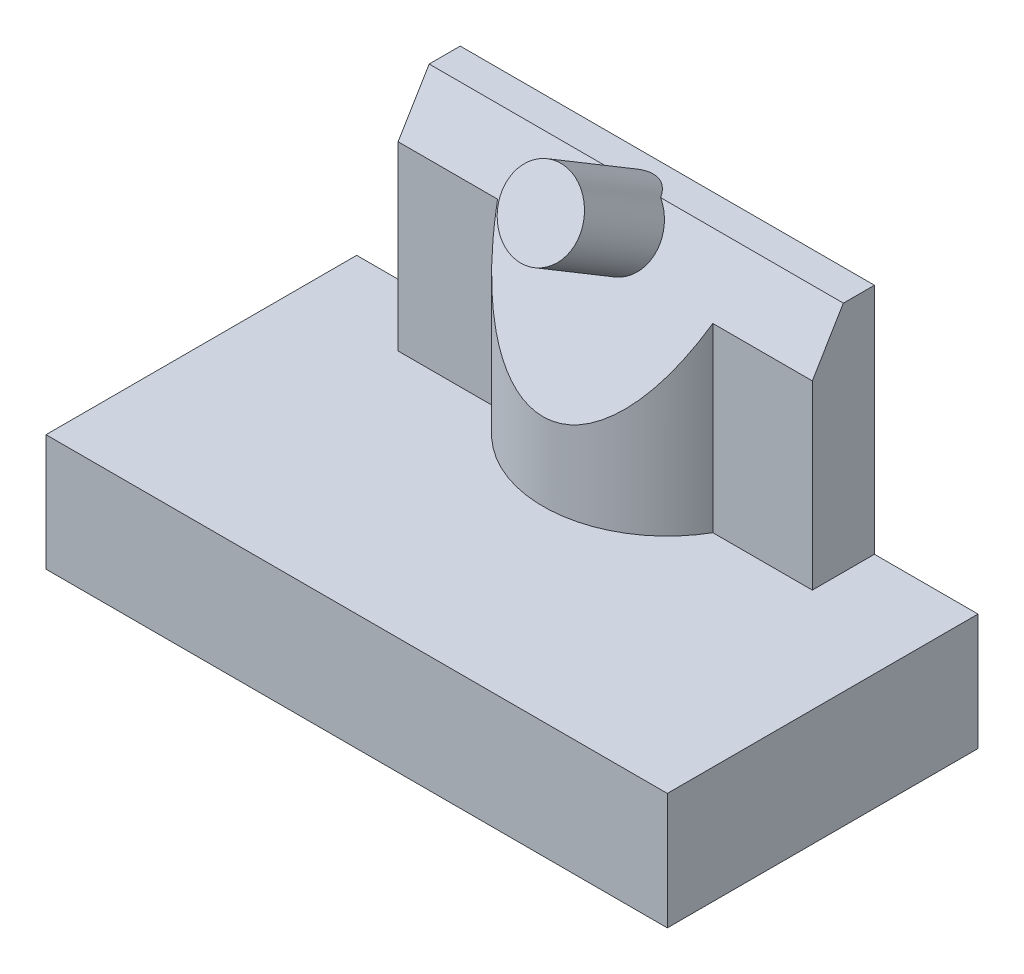
ISO-10303-21;
HEADER;
FILE_DESCRIPTION(('STEP AP214'),'2;1');
FILE_NAME('part.step','',(''),(''),'','','');
FILE_SCHEMA(('AUTOMOTIVE_DESIGN { 1 0 10303 214 1 1 1 1 }'));
ENDSEC;
DATA;
#1=APPLICATION_CONTEXT('core data for automotive mechanical design processes');
#2=APPLICATION_PROTOCOL_DEFINITION('international standard','automotive_design',2000,#1);
#3=PRODUCT_CONTEXT('',#1,'mechanical');
#4=PRODUCT('Part','Part','',(#3));
#5=PRODUCT_RELATED_PRODUCT_CATEGORY('part','',(#4));
#6=PRODUCT_DEFINITION_FORMATION('','',#4);
#7=PRODUCT_DEFINITION_CONTEXT('part definition',#1,'design');
#8=PRODUCT_DEFINITION('design','',#6,#7);
#9=PRODUCT_DEFINITION_SHAPE('','',#8);
#10=(LENGTH_UNIT() NAMED_UNIT(*) SI_UNIT(.MILLI.,.METRE.));
#11=(NAMED_UNIT(*) PLANE_ANGLE_UNIT() SI_UNIT($,.RADIAN.));
#12=(NAMED_UNIT(*) SI_UNIT($,.STERADIAN.) SOLID_ANGLE_UNIT());
#13=UNCERTAINTY_MEASURE_WITH_UNIT(LENGTH_MEASURE(1.E-05),#10,'distance_accuracy_value','');
#14=(GEOMETRIC_REPRESENTATION_CONTEXT(3) GLOBAL_UNCERTAINTY_ASSIGNED_CONTEXT((#13)) GLOBAL_UNIT_ASSIGNED_CONTEXT((#10,
#11,#12)) REPRESENTATION_CONTEXT('',''));
#15=CARTESIAN_POINT('',(0.,0.,0.));
#16=DIRECTION('',(0.,0.,1.));
#17=DIRECTION('',(1.,0.,0.));
#18=AXIS2_PLACEMENT_3D('',#15,#16,#17);
#19=CARTESIAN_POINT('',(-60.,37.5,-5.99750013866513));
#20=DIRECTION('',(0.,-0.51454829207469,-0.857461401535381));
#21=DIRECTION('',(0.,0.857461401535381,-0.51454829207469));
#22=AXIS2_PLACEMENT_3D('',#19,#20,#21);
#23=PLANE('',#22);
#24=CARTESIAN_POINT('',(0.,62.5006943094998,-21.0000000000001));
#25=DIRECTION('',(0.,0.514548292074691,0.85746140153538));
#26=DIRECTION('',(0.,-0.85746140153538,0.514548292074691));
#27=AXIS2_PLACEMENT_3D('',#24,#25,#26);
#28=CIRCLE('',#27,7.50000000000001);
#29=CARTESIAN_POINT('',(-4.71772642412974,67.5,-24.));
#30=VERTEX_POINT('',#29);
#31=CARTESIAN_POINT('',(4.71772642412976,67.5,-24.0000000000001));
#32=VERTEX_POINT('',#31);
#33=EDGE_CURVE('E47',#30,#32,#28,.T.);
#34=ORIENTED_EDGE('',*,*,#33,.F.);
#35=DIRECTION('',(-1.,0.,0.));
#36=VECTOR('',#35,1.);
#37=CARTESIAN_POINT('',(0.,67.5,-24.));
#38=LINE('',#37,#36);
#39=CARTESIAN_POINT('',(-40.,67.5,-24.));
#40=VERTEX_POINT('',#39);
#41=EDGE_CURVE('E41',#30,#40,#38,.T.);
#42=ORIENTED_EDGE('',*,*,#41,.T.);
#43=DIRECTION('',(0.,0.857461401535381,-0.51454829207469));
#44=VECTOR('',#43,1.);
#45=CARTESIAN_POINT('',(-40.,70.14723179808,-25.5885596692619));
#46=LINE('',#45,#44);
#47=CARTESIAN_POINT('',(-40.,57.5013886189996,-18.));
#48=VERTEX_POINT('',#47);
#49=EDGE_CURVE('E160',#48,#40,#46,.T.);
#50=ORIENTED_EDGE('',*,*,#49,.F.);
#51=DIRECTION('',(-1.,0.,0.));
#52=VECTOR('',#51,1.);
#53=CARTESIAN_POINT('',(-40.,57.5013886189996,-18.));
#54=LINE('',#53,#52);
#55=CARTESIAN_POINT('',(-20.7874962319511,57.5013886189997,-18.));
#56=VERTEX_POINT('',#55);
#57=EDGE_CURVE('E157',#56,#48,#54,.T.);
#58=ORIENTED_EDGE('',*,*,#57,.F.);
#59=CARTESIAN_POINT('',(0.,77.4986113810003,-30.));
#60=DIRECTION('',(0.,-0.51454829207469,-0.857461401535381));
#61=DIRECTION('',(0.,-0.857461401535381,0.51454829207469));
#62=AXIS2_PLACEMENT_3D('',#59,#60,#61);
#63=ELLIPSE('',#62,46.6477106833944,24.0024998613349);
#64=CARTESIAN_POINT('',(20.7874962319511,57.5013886189997,-18.));
#65=VERTEX_POINT('',#64);
#66=EDGE_CURVE('E163',#65,#56,#63,.T.);
#67=ORIENTED_EDGE('',*,*,#66,.F.);
#68=DIRECTION('',(-1.,0.,0.));
#69=VECTOR('',#68,1.);
#70=CARTESIAN_POINT('',(40.,57.5013886189997,-18.));
#71=LINE('',#70,#69);
#72=CARTESIAN_POINT('',(40.,57.5013886189997,-18.));
#73=VERTEX_POINT('',#72);
#74=EDGE_CURVE('E165',#73,#65,#71,.T.);
#75=ORIENTED_EDGE('',*,*,#74,.F.);
#76=DIRECTION('',(0.,0.857461401535381,-0.51454829207469));
#77=VECTOR('',#76,1.);
#78=CARTESIAN_POINT('',(40.,37.5,-5.99750013866513));
#79=LINE('',#78,#77);
#80=CARTESIAN_POINT('',(40.,67.5,-24.));
#81=VERTEX_POINT('',#80);
#82=EDGE_CURVE('E53',#73,#81,#79,.T.);
#83=ORIENTED_EDGE('',*,*,#82,.T.);
#84=EDGE_CURVE('E11',#81,#32,#38,.T.);
#85=ORIENTED_EDGE('',*,*,#84,.T.);
#86=EDGE_LOOP('',(#34,#42,#50,#58,#67,#75,#83,#85));
#87=FACE_BOUND('',#86,.T.);
#88=ADVANCED_FACE('F33',(#87),#23,.F.);
#89=CARTESIAN_POINT('',(-60.,22.5,30.));
#90=DIRECTION('',(1.,0.,0.));
#91=DIRECTION('',(0.,0.,-1.));
#92=AXIS2_PLACEMENT_3D('',#89,#90,#91);
#93=PLANE('',#92);
#94=DIRECTION('',(0.,0.,1.));
#95=VECTOR('',#94,1.);
#96=CARTESIAN_POINT('',(-60.,0.,30.));
#97=LINE('',#96,#95);
#98=CARTESIAN_POINT('',(-60.,0.,-30.));
#99=VERTEX_POINT('',#98);
#100=CARTESIAN_POINT('',(-60.,0.,30.));
#101=VERTEX_POINT('',#100);
#102=EDGE_CURVE('E207',#99,#101,#97,.T.);
#103=ORIENTED_EDGE('',*,*,#102,.T.);
#104=DIRECTION('',(0.,-1.,0.));
#105=VECTOR('',#104,1.);
#106=CARTESIAN_POINT('',(-60.,22.5,30.));
#107=LINE('',#106,#105);
#108=CARTESIAN_POINT('',(-60.,22.5,30.));
#109=VERTEX_POINT('',#108);
#110=EDGE_CURVE('E261',#109,#101,#107,.T.);
#111=ORIENTED_EDGE('',*,*,#110,.F.);
#112=DIRECTION('',(0.,0.,1.));
#113=VECTOR('',#112,1.);
#114=CARTESIAN_POINT('',(-60.,22.5,30.));
#115=LINE('',#114,#113);
#116=CARTESIAN_POINT('',(-60.,22.5,-30.));
#117=VERTEX_POINT('',#116);
#118=EDGE_CURVE('E235',#117,#109,#115,.T.);
#119=ORIENTED_EDGE('',*,*,#118,.F.);
#120=DIRECTION('',(0.,-1.,0.));
#121=VECTOR('',#120,1.);
#122=CARTESIAN_POINT('',(-60.,22.5,-30.));
#123=LINE('',#122,#121);
#124=EDGE_CURVE('E246',#117,#99,#123,.T.);
#125=ORIENTED_EDGE('',*,*,#124,.T.);
#126=EDGE_LOOP('',(#103,#111,#119,#125));
#127=FACE_BOUND('',#126,.T.);
#128=ADVANCED_FACE('F35',(#127),#93,.F.);
#129=CARTESIAN_POINT('',(60.,22.5,30.));
#130=DIRECTION('',(0.,0.,-1.));
#131=DIRECTION('',(-1.,0.,0.));
#132=AXIS2_PLACEMENT_3D('',#129,#130,#131);
#133=PLANE('',#132);
#134=DIRECTION('',(1.,0.,0.));
#135=VECTOR('',#134,1.);
#136=CARTESIAN_POINT('',(60.,0.,30.));
#137=LINE('',#136,#135);
#138=CARTESIAN_POINT('',(60.,0.,30.));
#139=VERTEX_POINT('',#138);
#140=EDGE_CURVE('E249',#101,#139,#137,.T.);
#141=ORIENTED_EDGE('',*,*,#140,.T.);
#142=DIRECTION('',(0.,-1.,0.));
#143=VECTOR('',#142,1.);
#144=CARTESIAN_POINT('',(60.,22.5,30.));
#145=LINE('',#144,#143);
#146=CARTESIAN_POINT('',(60.,22.5,30.));
#147=VERTEX_POINT('',#146);
#148=EDGE_CURVE('E259',#147,#139,#145,.T.);
#149=ORIENTED_EDGE('',*,*,#148,.F.);
#150=DIRECTION('',(1.,0.,0.));
#151=VECTOR('',#150,1.);
#152=CARTESIAN_POINT('',(60.,22.5,30.));
#153=LINE('',#152,#151);
#154=EDGE_CURVE('E238',#109,#147,#153,.T.);
#155=ORIENTED_EDGE('',*,*,#154,.F.);
#156=ORIENTED_EDGE('',*,*,#110,.T.);
#157=EDGE_LOOP('',(#141,#149,#155,#156));
#158=FACE_BOUND('',#157,.T.);
#159=ADVANCED_FACE('F309',(#158),#133,.F.);
#160=CARTESIAN_POINT('',(60.,22.5,30.));
#161=DIRECTION('',(-1.,0.,0.));
#162=DIRECTION('',(0.,0.,1.));
#163=AXIS2_PLACEMENT_3D('',#160,#161,#162);
#164=PLANE('',#163);
#165=DIRECTION('',(0.,0.,-1.));
#166=VECTOR('',#165,1.);
#167=CARTESIAN_POINT('',(60.,0.,30.));
#168=LINE('',#167,#166);
#169=CARTESIAN_POINT('',(60.,0.,-30.));
#170=VERTEX_POINT('',#169);
#171=EDGE_CURVE('E251',#139,#170,#168,.T.);
#172=ORIENTED_EDGE('',*,*,#171,.T.);
#173=DIRECTION('',(0.,-1.,0.));
#174=VECTOR('',#173,1.);
#175=CARTESIAN_POINT('',(60.,22.5,-30.));
#176=LINE('',#175,#174);
#177=CARTESIAN_POINT('',(60.,22.5,-30.));
#178=VERTEX_POINT('',#177);
#179=EDGE_CURVE('E256',#178,#170,#176,.T.);
#180=ORIENTED_EDGE('',*,*,#179,.F.);
#181=DIRECTION('',(0.,0.,-1.));
#182=VECTOR('',#181,1.);
#183=CARTESIAN_POINT('',(60.,22.5,30.));
#184=LINE('',#183,#182);
#185=EDGE_CURVE('E241',#147,#178,#184,.T.);
#186=ORIENTED_EDGE('',*,*,#185,.F.);
#187=ORIENTED_EDGE('',*,*,#148,.T.);
#188=EDGE_LOOP('',(#172,#180,#186,#187));
#189=FACE_BOUND('',#188,.T.);
#190=ADVANCED_FACE('F331',(#189),#164,.F.);
#191=CARTESIAN_POINT('',(60.,22.5,-30.));
#192=DIRECTION('',(0.,0.,1.));
#193=DIRECTION('',(1.,0.,0.));
#194=AXIS2_PLACEMENT_3D('',#191,#192,#193);
#195=PLANE('',#194);
#196=DIRECTION('',(-1.,0.,0.));
#197=VECTOR('',#196,1.);
#198=CARTESIAN_POINT('',(60.,0.,-30.));
#199=LINE('',#198,#197);
#200=EDGE_CURVE('E239',#170,#99,#199,.T.);
#201=ORIENTED_EDGE('',*,*,#200,.T.);
#202=ORIENTED_EDGE('',*,*,#124,.F.);
#203=DIRECTION('',(-1.,0.,0.));
#204=VECTOR('',#203,1.);
#205=CARTESIAN_POINT('',(60.,22.5,-30.));
#206=LINE('',#205,#204);
#207=CARTESIAN_POINT('',(-40.,22.5,-30.));
#208=VERTEX_POINT('',#207);
#209=EDGE_CURVE('E243',#208,#117,#206,.T.);
#210=ORIENTED_EDGE('',*,*,#209,.F.);
#211=DIRECTION('',(0.,-1.,0.));
#212=VECTOR('',#211,1.);
#213=CARTESIAN_POINT('',(-40.,67.5,-30.));
#214=LINE('',#213,#212);
#215=CARTESIAN_POINT('',(-40.,67.5,-30.));
#216=VERTEX_POINT('',#215);
#217=EDGE_CURVE('E193',#216,#208,#214,.T.);
#218=ORIENTED_EDGE('',*,*,#217,.F.);
#219=DIRECTION('',(-1.,0.,0.));
#220=VECTOR('',#219,1.);
#221=CARTESIAN_POINT('',(-40.,67.5,-30.));
#222=LINE('',#221,#220);
#223=CARTESIAN_POINT('',(40.,67.5,-30.));
#224=VERTEX_POINT('',#223);
#225=EDGE_CURVE('E171',#224,#216,#222,.T.);
#226=ORIENTED_EDGE('',*,*,#225,.F.);
#227=DIRECTION('',(0.,-1.,0.));
#228=VECTOR('',#227,1.);
#229=CARTESIAN_POINT('',(40.,67.5,-30.));
#230=LINE('',#229,#228);
#231=CARTESIAN_POINT('',(40.,22.5,-30.));
#232=VERTEX_POINT('',#231);
#233=EDGE_CURVE('E196',#224,#232,#230,.T.);
#234=ORIENTED_EDGE('',*,*,#233,.T.);
#235=EDGE_CURVE('E244',#178,#232,#206,.T.);
#236=ORIENTED_EDGE('',*,*,#235,.F.);
#237=ORIENTED_EDGE('',*,*,#179,.T.);
#238=EDGE_LOOP('',(#201,#202,#210,#218,#226,#234,#236,#237));
#239=FACE_BOUND('',#238,.T.);
#240=ADVANCED_FACE('F275',(#239),#195,.F.);
#241=CARTESIAN_POINT('',(0.,22.5,0.));
#242=DIRECTION('',(0.,1.,0.));
#243=DIRECTION('',(0.,0.,1.));
#244=AXIS2_PLACEMENT_3D('',#241,#242,#243);
#245=PLANE('',#244);
#246=DIRECTION('',(0.,0.,1.));
#247=VECTOR('',#246,1.);
#248=CARTESIAN_POINT('',(-40.,22.5,-30.));
#249=LINE('',#248,#247);
#250=CARTESIAN_POINT('',(-40.,22.5,-18.));
#251=VERTEX_POINT('',#250);
#252=EDGE_CURVE('E185',#208,#251,#249,.T.);
#253=ORIENTED_EDGE('',*,*,#252,.F.);
#254=ORIENTED_EDGE('',*,*,#209,.T.);
#255=ORIENTED_EDGE('',*,*,#118,.T.);
#256=ORIENTED_EDGE('',*,*,#154,.T.);
#257=ORIENTED_EDGE('',*,*,#185,.T.);
#258=ORIENTED_EDGE('',*,*,#235,.T.);
#259=DIRECTION('',(0.,0.,-1.));
#260=VECTOR('',#259,1.);
#261=CARTESIAN_POINT('',(40.,22.5,-30.));
#262=LINE('',#261,#260);
#263=CARTESIAN_POINT('',(40.,22.5,-18.));
#264=VERTEX_POINT('',#263);
#265=EDGE_CURVE('E182',#264,#232,#262,.T.);
#266=ORIENTED_EDGE('',*,*,#265,.F.);
#267=DIRECTION('',(1.,0.,0.));
#268=VECTOR('',#267,1.);
#269=CARTESIAN_POINT('',(40.,22.5,-18.));
#270=LINE('',#269,#268);
#271=CARTESIAN_POINT('',(20.7874962319511,22.5,-18.));
#272=VERTEX_POINT('',#271);
#273=EDGE_CURVE('E179',#272,#264,#270,.T.);
#274=ORIENTED_EDGE('',*,*,#273,.F.);
#275=CARTESIAN_POINT('',(0.,22.5,-30.));
#276=DIRECTION('',(0.,1.,0.));
#277=DIRECTION('',(0.,0.,1.));
#278=AXIS2_PLACEMENT_3D('',#275,#276,#277);
#279=CIRCLE('',#278,24.0024998613349);
#280=CARTESIAN_POINT('',(-20.7874962319511,22.5,-18.));
#281=VERTEX_POINT('',#280);
#282=EDGE_CURVE('E168',#281,#272,#279,.T.);
#283=ORIENTED_EDGE('',*,*,#282,.F.);
#284=DIRECTION('',(1.,0.,0.));
#285=VECTOR('',#284,1.);
#286=CARTESIAN_POINT('',(-40.,22.5,-18.));
#287=LINE('',#286,#285);
#288=EDGE_CURVE('E172',#251,#281,#287,.T.);
#289=ORIENTED_EDGE('',*,*,#288,.F.);
#290=EDGE_LOOP('',(#253,#254,#255,#256,#257,#258,#266,#274,#283,#289));
#291=FACE_BOUND('',#290,.T.);
#292=ADVANCED_FACE('F279',(#291),#245,.T.);
#293=CARTESIAN_POINT('',(0.,0.,0.));
#294=DIRECTION('',(0.,1.,0.));
#295=DIRECTION('',(0.,0.,1.));
#296=AXIS2_PLACEMENT_3D('',#293,#294,#295);
#297=PLANE('',#296);
#298=DIRECTION('',(-1.,0.,0.));
#299=VECTOR('',#298,1.);
#300=CARTESIAN_POINT('',(60.,0.,-29.));
#301=LINE('',#300,#299);
#302=CARTESIAN_POINT('',(59.,0.,-29.));
#303=VERTEX_POINT('',#302);
#304=CARTESIAN_POINT('',(-59.,0.,-29.));
#305=VERTEX_POINT('',#304);
#306=EDGE_CURVE('E213',#303,#305,#301,.T.);
#307=ORIENTED_EDGE('',*,*,#306,.T.);
#308=DIRECTION('',(0.,0.,1.));
#309=VECTOR('',#308,1.);
#310=CARTESIAN_POINT('',(-59.,0.,30.));
#311=LINE('',#310,#309);
#312=CARTESIAN_POINT('',(-59.,0.,29.));
#313=VERTEX_POINT('',#312);
#314=EDGE_CURVE('E203',#305,#313,#311,.T.);
#315=ORIENTED_EDGE('',*,*,#314,.T.);
#316=DIRECTION('',(1.,0.,0.));
#317=VECTOR('',#316,1.);
#318=CARTESIAN_POINT('',(60.,0.,29.));
#319=LINE('',#318,#317);
#320=CARTESIAN_POINT('',(59.,0.,29.));
#321=VERTEX_POINT('',#320);
#322=EDGE_CURVE('E227',#313,#321,#319,.T.);
#323=ORIENTED_EDGE('',*,*,#322,.T.);
#324=DIRECTION('',(0.,0.,-1.));
#325=VECTOR('',#324,1.);
#326=CARTESIAN_POINT('',(59.,0.,30.));
#327=LINE('',#326,#325);
#328=EDGE_CURVE('E230',#321,#303,#327,.T.);
#329=ORIENTED_EDGE('',*,*,#328,.T.);
#330=EDGE_LOOP('',(#307,#315,#323,#329));
#331=FACE_BOUND('',#330,.T.);
#332=ORIENTED_EDGE('',*,*,#102,.F.);
#333=ORIENTED_EDGE('',*,*,#200,.F.);
#334=ORIENTED_EDGE('',*,*,#171,.F.);
#335=ORIENTED_EDGE('',*,*,#140,.F.);
#336=EDGE_LOOP('',(#332,#333,#334,#335));
#337=FACE_BOUND('',#336,.T.);
#338=ADVANCED_FACE('F335',(#331,#337),#297,.F.);
#339=CARTESIAN_POINT('',(-59.,22.5,30.));
#340=DIRECTION('',(1.,0.,0.));
#341=DIRECTION('',(0.,0.,-1.));
#342=AXIS2_PLACEMENT_3D('',#339,#340,#341);
#343=PLANE('',#342);
#344=ORIENTED_EDGE('',*,*,#314,.F.);
#345=DIRECTION('',(0.,-1.,0.));
#346=VECTOR('',#345,1.);
#347=CARTESIAN_POINT('',(-59.,22.5,-29.));
#348=LINE('',#347,#346);
#349=CARTESIAN_POINT('',(-59.,21.5,-29.));
#350=VERTEX_POINT('',#349);
#351=EDGE_CURVE('E214',#350,#305,#348,.T.);
#352=ORIENTED_EDGE('',*,*,#351,.F.);
#353=DIRECTION('',(0.,0.,1.));
#354=VECTOR('',#353,1.);
#355=CARTESIAN_POINT('',(-59.,21.5,30.));
#356=LINE('',#355,#354);
#357=CARTESIAN_POINT('',(-59.,21.5,29.));
#358=VERTEX_POINT('',#357);
#359=EDGE_CURVE('E209',#350,#358,#356,.T.);
#360=ORIENTED_EDGE('',*,*,#359,.T.);
#361=DIRECTION('',(0.,-1.,0.));
#362=VECTOR('',#361,1.);
#363=CARTESIAN_POINT('',(-59.,22.5,29.));
#364=LINE('',#363,#362);
#365=EDGE_CURVE('E204',#358,#313,#364,.T.);
#366=ORIENTED_EDGE('',*,*,#365,.T.);
#367=EDGE_LOOP('',(#344,#352,#360,#366));
#368=FACE_BOUND('',#367,.T.);
#369=ADVANCED_FACE('F347',(#368),#343,.T.);
#370=CARTESIAN_POINT('',(60.,22.5,29.));
#371=DIRECTION('',(0.,0.,-1.));
#372=DIRECTION('',(-1.,0.,0.));
#373=AXIS2_PLACEMENT_3D('',#370,#371,#372);
#374=PLANE('',#373);
#375=ORIENTED_EDGE('',*,*,#322,.F.);
#376=ORIENTED_EDGE('',*,*,#365,.F.);
#377=DIRECTION('',(1.,0.,0.));
#378=VECTOR('',#377,1.);
#379=CARTESIAN_POINT('',(60.,21.5,29.));
#380=LINE('',#379,#378);
#381=CARTESIAN_POINT('',(59.,21.5,29.));
#382=VERTEX_POINT('',#381);
#383=EDGE_CURVE('E212',#358,#382,#380,.T.);
#384=ORIENTED_EDGE('',*,*,#383,.T.);
#385=DIRECTION('',(0.,-1.,0.));
#386=VECTOR('',#385,1.);
#387=CARTESIAN_POINT('',(59.,22.5,29.));
#388=LINE('',#387,#386);
#389=EDGE_CURVE('E208',#382,#321,#388,.T.);
#390=ORIENTED_EDGE('',*,*,#389,.T.);
#391=EDGE_LOOP('',(#375,#376,#384,#390));
#392=FACE_BOUND('',#391,.T.);
#393=ADVANCED_FACE('F357',(#392),#374,.T.);
#394=CARTESIAN_POINT('',(59.,22.5,30.));
#395=DIRECTION('',(-1.,0.,0.));
#396=DIRECTION('',(0.,0.,1.));
#397=AXIS2_PLACEMENT_3D('',#394,#395,#396);
#398=PLANE('',#397);
#399=ORIENTED_EDGE('',*,*,#328,.F.);
#400=ORIENTED_EDGE('',*,*,#389,.F.);
#401=DIRECTION('',(0.,0.,-1.));
#402=VECTOR('',#401,1.);
#403=CARTESIAN_POINT('',(59.,21.5,30.));
#404=LINE('',#403,#402);
#405=CARTESIAN_POINT('',(59.,21.5,-29.));
#406=VERTEX_POINT('',#405);
#407=EDGE_CURVE('E221',#382,#406,#404,.T.);
#408=ORIENTED_EDGE('',*,*,#407,.T.);
#409=DIRECTION('',(0.,-1.,0.));
#410=VECTOR('',#409,1.);
#411=CARTESIAN_POINT('',(59.,22.5,-29.));
#412=LINE('',#411,#410);
#413=EDGE_CURVE('E216',#406,#303,#412,.T.);
#414=ORIENTED_EDGE('',*,*,#413,.T.);
#415=EDGE_LOOP('',(#399,#400,#408,#414));
#416=FACE_BOUND('',#415,.T.);
#417=ADVANCED_FACE('F353',(#416),#398,.T.);
#418=CARTESIAN_POINT('',(60.,22.5,-29.));
#419=DIRECTION('',(0.,0.,1.));
#420=DIRECTION('',(1.,0.,0.));
#421=AXIS2_PLACEMENT_3D('',#418,#419,#420);
#422=PLANE('',#421);
#423=ORIENTED_EDGE('',*,*,#306,.F.);
#424=ORIENTED_EDGE('',*,*,#413,.F.);
#425=DIRECTION('',(-1.,0.,0.));
#426=VECTOR('',#425,1.);
#427=CARTESIAN_POINT('',(60.,21.5,-29.));
#428=LINE('',#427,#426);
#429=EDGE_CURVE('E217',#406,#350,#428,.T.);
#430=ORIENTED_EDGE('',*,*,#429,.T.);
#431=ORIENTED_EDGE('',*,*,#351,.T.);
#432=EDGE_LOOP('',(#423,#424,#430,#431));
#433=FACE_BOUND('',#432,.T.);
#434=ADVANCED_FACE('F300',(#433),#422,.T.);
#435=CARTESIAN_POINT('',(0.,21.5,0.));
#436=DIRECTION('',(0.,1.,0.));
#437=DIRECTION('',(0.,0.,1.));
#438=AXIS2_PLACEMENT_3D('',#435,#436,#437);
#439=PLANE('',#438);
#440=ORIENTED_EDGE('',*,*,#359,.F.);
#441=ORIENTED_EDGE('',*,*,#429,.F.);
#442=ORIENTED_EDGE('',*,*,#407,.F.);
#443=ORIENTED_EDGE('',*,*,#383,.F.);
#444=EDGE_LOOP('',(#440,#441,#442,#443));
#445=FACE_BOUND('',#444,.T.);
#446=ADVANCED_FACE('F292',(#445),#439,.F.);
#447=CARTESIAN_POINT('',(0.,67.5,-30.));
#448=DIRECTION('',(0.,-1.,0.));
#449=DIRECTION('',(0.,0.,-1.));
#450=AXIS2_PLACEMENT_3D('',#447,#448,#449);
#451=CYLINDRICAL_SURFACE('',#450,24.0024998613349);
#452=ORIENTED_EDGE('',*,*,#66,.T.);
#453=DIRECTION('',(0.,-1.,0.));
#454=VECTOR('',#453,1.);
#455=CARTESIAN_POINT('',(-20.7874962319511,67.5,-18.));
#456=LINE('',#455,#454);
#457=EDGE_CURVE('E176',#56,#281,#456,.T.);
#458=ORIENTED_EDGE('',*,*,#457,.T.);
#459=ORIENTED_EDGE('',*,*,#282,.T.);
#460=DIRECTION('',(0.,-1.,0.));
#461=VECTOR('',#460,1.);
#462=CARTESIAN_POINT('',(20.7874962319511,67.5,-18.));
#463=LINE('',#462,#461);
#464=EDGE_CURVE('E201',#65,#272,#463,.T.);
#465=ORIENTED_EDGE('',*,*,#464,.F.);
#466=EDGE_LOOP('',(#452,#458,#459,#465));
#467=FACE_BOUND('',#466,.T.);
#468=ADVANCED_FACE('F290',(#467),#451,.T.);
#469=CARTESIAN_POINT('',(40.,67.5,-18.));
#470=DIRECTION('',(0.,0.,-1.));
#471=DIRECTION('',(-1.,0.,0.));
#472=AXIS2_PLACEMENT_3D('',#469,#470,#471);
#473=PLANE('',#472);
#474=DIRECTION('',(0.,-1.,0.));
#475=VECTOR('',#474,1.);
#476=CARTESIAN_POINT('',(40.,67.5,-18.));
#477=LINE('',#476,#475);
#478=EDGE_CURVE('E199',#73,#264,#477,.T.);
#479=ORIENTED_EDGE('',*,*,#478,.F.);
#480=ORIENTED_EDGE('',*,*,#74,.T.);
#481=ORIENTED_EDGE('',*,*,#464,.T.);
#482=ORIENTED_EDGE('',*,*,#273,.T.);
#483=EDGE_LOOP('',(#479,#480,#481,#482));
#484=FACE_BOUND('',#483,.T.);
#485=ADVANCED_FACE('F289',(#484),#473,.F.);
#486=CARTESIAN_POINT('',(40.,67.5,-30.));
#487=DIRECTION('',(-1.,0.,0.));
#488=DIRECTION('',(0.,0.,1.));
#489=AXIS2_PLACEMENT_3D('',#486,#487,#488);
#490=PLANE('',#489);
#491=DIRECTION('',(0.,0.,-1.));
#492=VECTOR('',#491,1.);
#493=CARTESIAN_POINT('',(40.,67.5,-30.));
#494=LINE('',#493,#492);
#495=EDGE_CURVE('E169',#81,#224,#494,.T.);
#496=ORIENTED_EDGE('',*,*,#495,.F.);
#497=ORIENTED_EDGE('',*,*,#82,.F.);
#498=ORIENTED_EDGE('',*,*,#478,.T.);
#499=ORIENTED_EDGE('',*,*,#265,.T.);
#500=ORIENTED_EDGE('',*,*,#233,.F.);
#501=EDGE_LOOP('',(#496,#497,#498,#499,#500));
#502=FACE_BOUND('',#501,.T.);
#503=ADVANCED_FACE('F298',(#502),#490,.F.);
#504=CARTESIAN_POINT('',(-40.,67.5,-30.));
#505=DIRECTION('',(1.,0.,0.));
#506=DIRECTION('',(0.,0.,-1.));
#507=AXIS2_PLACEMENT_3D('',#504,#505,#506);
#508=PLANE('',#507);
#509=DIRECTION('',(0.,-1.,0.));
#510=VECTOR('',#509,1.);
#511=CARTESIAN_POINT('',(-40.,67.5,-18.));
#512=LINE('',#511,#510);
#513=EDGE_CURVE('E191',#48,#251,#512,.T.);
#514=ORIENTED_EDGE('',*,*,#513,.F.);
#515=ORIENTED_EDGE('',*,*,#49,.T.);
#516=DIRECTION('',(0.,0.,1.));
#517=VECTOR('',#516,1.);
#518=CARTESIAN_POINT('',(-40.,67.5,-30.));
#519=LINE('',#518,#517);
#520=EDGE_CURVE('E174',#216,#40,#519,.T.);
#521=ORIENTED_EDGE('',*,*,#520,.F.);
#522=ORIENTED_EDGE('',*,*,#217,.T.);
#523=ORIENTED_EDGE('',*,*,#252,.T.);
#524=EDGE_LOOP('',(#514,#515,#521,#522,#523));
#525=FACE_BOUND('',#524,.T.);
#526=ADVANCED_FACE('F269',(#525),#508,.F.);
#527=CARTESIAN_POINT('',(-40.,67.5,-18.));
#528=DIRECTION('',(0.,0.,-1.));
#529=DIRECTION('',(-1.,0.,0.));
#530=AXIS2_PLACEMENT_3D('',#527,#528,#529);
#531=PLANE('',#530);
#532=ORIENTED_EDGE('',*,*,#457,.F.);
#533=ORIENTED_EDGE('',*,*,#57,.T.);
#534=ORIENTED_EDGE('',*,*,#513,.T.);
#535=ORIENTED_EDGE('',*,*,#288,.T.);
#536=EDGE_LOOP('',(#532,#533,#534,#535));
#537=FACE_BOUND('',#536,.T.);
#538=ADVANCED_FACE('F284',(#537),#531,.F.);
#539=CARTESIAN_POINT('',(0.,67.5,-30.));
#540=DIRECTION('',(0.,1.,0.));
#541=DIRECTION('',(0.,0.,1.));
#542=AXIS2_PLACEMENT_3D('',#539,#540,#541);
#543=PLANE('',#542);
#544=ORIENTED_EDGE('',*,*,#41,.F.);
#545=CARTESIAN_POINT('',(0.,67.4999999999955,-12.6689808710125));
#546=DIRECTION('',(0.,1.,0.));
#547=DIRECTION('',(0.,0.,1.));
#548=AXIS2_PLACEMENT_3D('',#545,#546,#547);
#549=ELLIPSE('',#548,14.5758913507604,7.50000000000001);
#550=EDGE_CURVE('E145',#30,#32,#549,.F.);
#551=ORIENTED_EDGE('',*,*,#550,.T.);
#552=ORIENTED_EDGE('',*,*,#84,.F.);
#553=ORIENTED_EDGE('',*,*,#495,.T.);
#554=ORIENTED_EDGE('',*,*,#225,.T.);
#555=ORIENTED_EDGE('',*,*,#520,.T.);
#556=EDGE_LOOP('',(#544,#551,#552,#553,#554,#555));
#557=FACE_BOUND('',#556,.T.);
#558=ADVANCED_FACE('F146',(#557),#543,.T.);
#559=CARTESIAN_POINT('',(0.,71.7625635668442,-5.56569477236321));
#560=DIRECTION('',(0.,-0.514548292074691,-0.85746140153538));
#561=DIRECTION('',(0.,0.85746140153538,-0.514548292074691));
#562=AXIS2_PLACEMENT_3D('',#559,#560,#561);
#563=CYLINDRICAL_SURFACE('',#562,7.50000000000001);
#564=CARTESIAN_POINT('',(0.,71.7625635668442,-5.56569477236321));
#565=DIRECTION('',(0.,0.514548292074691,0.85746140153538));
#566=DIRECTION('',(0.,-0.85746140153538,0.514548292074691));
#567=AXIS2_PLACEMENT_3D('',#564,#565,#566);
#568=CIRCLE('',#567,7.50000000000001);
#569=CARTESIAN_POINT('',(0.,65.3316030553289,-1.70658258180303));
#570=VERTEX_POINT('',#569);
#571=EDGE_CURVE('E151',#570,#570,#568,.T.);
#572=ORIENTED_EDGE('',*,*,#571,.F.);
#573=EDGE_LOOP('',(#572));
#574=FACE_BOUND('',#573,.T.);
#575=ORIENTED_EDGE('',*,*,#33,.T.);
#576=ORIENTED_EDGE('',*,*,#550,.F.);
#577=EDGE_LOOP('',(#575,#576));
#578=FACE_BOUND('',#577,.T.);
#579=ADVANCED_FACE('F150',(#574,#578),#563,.T.);
#580=CARTESIAN_POINT('',(0.,71.7625635668442,-5.56569477236321));
#581=DIRECTION('',(0.,0.514548292074691,0.85746140153538));
#582=DIRECTION('',(0.,-0.85746140153538,0.514548292074691));
#583=AXIS2_PLACEMENT_3D('',#580,#581,#582);
#584=PLANE('',#583);
#585=ORIENTED_EDGE('',*,*,#571,.T.);
#586=EDGE_LOOP('',(#585));
#587=FACE_BOUND('',#586,.T.);
#588=ADVANCED_FACE('F451',(#587),#584,.T.);
#589=CLOSED_SHELL('',(#88,#128,#159,#190,#240,#292,#338,#369,#393,#417,#434,#446,#468,#485,#503,
#526,#538,#558,#579,#588));
#590=MANIFOLD_SOLID_BREP('B2',#589);
#591=ADVANCED_BREP_SHAPE_REPRESENTATION('',(#18,#590),#14);
#592=SHAPE_DEFINITION_REPRESENTATION(#9,#591);
ENDSEC;
END-ISO-10303-21;
